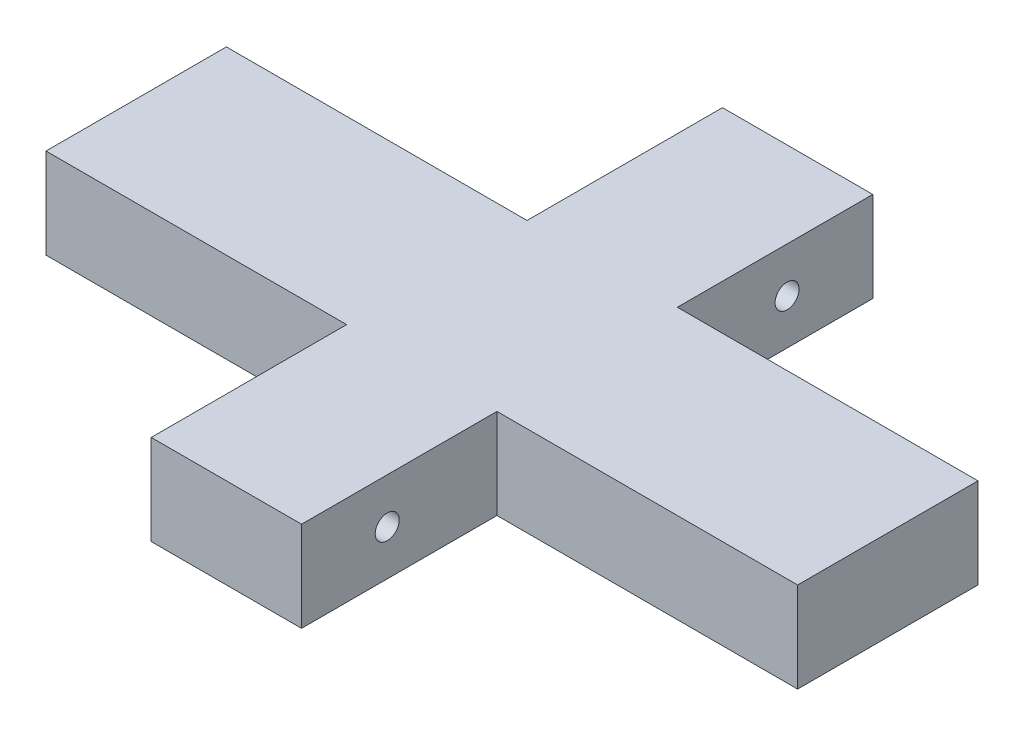
ISO-10303-21;
HEADER;
FILE_DESCRIPTION(('STEP AP214'),'2;1');
FILE_NAME('part.step','',(''),(''),'','','');
FILE_SCHEMA(('AUTOMOTIVE_DESIGN { 1 0 10303 214 1 1 1 1 }'));
ENDSEC;
DATA;
#1=APPLICATION_CONTEXT('core data for automotive mechanical design processes');
#2=APPLICATION_PROTOCOL_DEFINITION('international standard','automotive_design',2000,#1);
#3=PRODUCT_CONTEXT('',#1,'mechanical');
#4=PRODUCT('Part','Part','',(#3));
#5=PRODUCT_RELATED_PRODUCT_CATEGORY('part','',(#4));
#6=PRODUCT_DEFINITION_FORMATION('','',#4);
#7=PRODUCT_DEFINITION_CONTEXT('part definition',#1,'design');
#8=PRODUCT_DEFINITION('design','',#6,#7);
#9=PRODUCT_DEFINITION_SHAPE('','',#8);
#10=(LENGTH_UNIT() NAMED_UNIT(*) SI_UNIT(.MILLI.,.METRE.));
#11=(NAMED_UNIT(*) PLANE_ANGLE_UNIT() SI_UNIT($,.RADIAN.));
#12=(NAMED_UNIT(*) SI_UNIT($,.STERADIAN.) SOLID_ANGLE_UNIT());
#13=UNCERTAINTY_MEASURE_WITH_UNIT(LENGTH_MEASURE(1.E-05),#10,'distance_accuracy_value','');
#14=(GEOMETRIC_REPRESENTATION_CONTEXT(3) GLOBAL_UNCERTAINTY_ASSIGNED_CONTEXT((#13)) GLOBAL_UNIT_ASSIGNED_CONTEXT((#10,
#11,#12)) REPRESENTATION_CONTEXT('',''));
#15=CARTESIAN_POINT('',(0.,0.,0.));
#16=DIRECTION('',(0.,0.,1.));
#17=DIRECTION('',(1.,0.,0.));
#18=AXIS2_PLACEMENT_3D('',#15,#16,#17);
#19=CARTESIAN_POINT('',(-250.,60.,-60.));
#20=DIRECTION('',(1.,0.,0.));
#21=DIRECTION('',(0.,0.,-1.));
#22=AXIS2_PLACEMENT_3D('',#19,#20,#21);
#23=PLANE('',#22);
#24=DIRECTION('',(0.,0.,1.));
#25=VECTOR('',#24,1.);
#26=CARTESIAN_POINT('',(-250.,0.,-60.));
#27=LINE('',#26,#25);
#28=CARTESIAN_POINT('',(-250.,0.,-60.));
#29=VERTEX_POINT('',#28);
#30=CARTESIAN_POINT('',(-250.,0.,60.));
#31=VERTEX_POINT('',#30);
#32=EDGE_CURVE('E155',#29,#31,#27,.T.);
#33=ORIENTED_EDGE('',*,*,#32,.T.);
#34=DIRECTION('',(0.,-1.,0.));
#35=VECTOR('',#34,1.);
#36=CARTESIAN_POINT('',(-250.,60.,60.));
#37=LINE('',#36,#35);
#38=CARTESIAN_POINT('',(-250.,60.,60.));
#39=VERTEX_POINT('',#38);
#40=EDGE_CURVE('E11',#39,#31,#37,.T.);
#41=ORIENTED_EDGE('',*,*,#40,.F.);
#42=DIRECTION('',(0.,0.,1.));
#43=VECTOR('',#42,1.);
#44=CARTESIAN_POINT('',(-250.,60.,-60.));
#45=LINE('',#44,#43);
#46=CARTESIAN_POINT('',(-250.,60.,-60.));
#47=VERTEX_POINT('',#46);
#48=EDGE_CURVE('E178',#47,#39,#45,.T.);
#49=ORIENTED_EDGE('',*,*,#48,.F.);
#50=DIRECTION('',(0.,-1.,0.));
#51=VECTOR('',#50,1.);
#52=CARTESIAN_POINT('',(-250.,60.,-60.));
#53=LINE('',#52,#51);
#54=EDGE_CURVE('E151',#47,#29,#53,.T.);
#55=ORIENTED_EDGE('',*,*,#54,.T.);
#56=EDGE_LOOP('',(#33,#41,#49,#55));
#57=FACE_BOUND('',#56,.T.);
#58=ADVANCED_FACE('F33',(#57),#23,.F.);
#59=CARTESIAN_POINT('',(-50.,60.,59.9999999999999));
#60=DIRECTION('',(0.,0.,-1.));
#61=DIRECTION('',(-1.,0.,0.));
#62=AXIS2_PLACEMENT_3D('',#59,#60,#61);
#63=PLANE('',#62);
#64=DIRECTION('',(1.,0.,0.));
#65=VECTOR('',#64,1.);
#66=CARTESIAN_POINT('',(-50.,0.,59.9999999999999));
#67=LINE('',#66,#65);
#68=CARTESIAN_POINT('',(-50.,0.,59.9999999999999));
#69=VERTEX_POINT('',#68);
#70=EDGE_CURVE('E158',#31,#69,#67,.T.);
#71=ORIENTED_EDGE('',*,*,#70,.T.);
#72=DIRECTION('',(0.,-1.,0.));
#73=VECTOR('',#72,1.);
#74=CARTESIAN_POINT('',(-50.,60.,59.9999999999999));
#75=LINE('',#74,#73);
#76=CARTESIAN_POINT('',(-50.,60.,59.9999999999999));
#77=VERTEX_POINT('',#76);
#78=EDGE_CURVE('E42',#77,#69,#75,.T.);
#79=ORIENTED_EDGE('',*,*,#78,.F.);
#80=DIRECTION('',(1.,0.,0.));
#81=VECTOR('',#80,1.);
#82=CARTESIAN_POINT('',(-50.,60.,59.9999999999999));
#83=LINE('',#82,#81);
#84=EDGE_CURVE('E106',#39,#77,#83,.T.);
#85=ORIENTED_EDGE('',*,*,#84,.F.);
#86=ORIENTED_EDGE('',*,*,#40,.T.);
#87=EDGE_LOOP('',(#71,#79,#85,#86));
#88=FACE_BOUND('',#87,.T.);
#89=ADVANCED_FACE('F255',(#88),#63,.F.);
#90=CARTESIAN_POINT('',(-49.9999999999999,60.,190.));
#91=DIRECTION('',(1.,0.,0.));
#92=DIRECTION('',(0.,0.,-1.));
#93=AXIS2_PLACEMENT_3D('',#90,#91,#92);
#94=PLANE('',#93);
#95=CARTESIAN_POINT('',(-49.9999999999999,30.,133.));
#96=DIRECTION('',(1.,0.,0.));
#97=DIRECTION('',(0.,0.,-1.));
#98=AXIS2_PLACEMENT_3D('',#95,#96,#97);
#99=CIRCLE('',#98,8.00000000000004);
#100=CARTESIAN_POINT('',(-49.9999999999999,30.,125.));
#101=VERTEX_POINT('',#100);
#102=EDGE_CURVE('E159',#101,#101,#99,.T.);
#103=ORIENTED_EDGE('',*,*,#102,.T.);
#104=EDGE_LOOP('',(#103));
#105=FACE_BOUND('',#104,.T.);
#106=DIRECTION('',(0.,0.,1.));
#107=VECTOR('',#106,1.);
#108=CARTESIAN_POINT('',(-49.9999999999999,0.,190.));
#109=LINE('',#108,#107);
#110=CARTESIAN_POINT('',(-49.9999999999999,0.,190.));
#111=VERTEX_POINT('',#110);
#112=EDGE_CURVE('E161',#69,#111,#109,.T.);
#113=ORIENTED_EDGE('',*,*,#112,.T.);
#114=DIRECTION('',(0.,-1.,0.));
#115=VECTOR('',#114,1.);
#116=CARTESIAN_POINT('',(-49.9999999999999,60.,190.));
#117=LINE('',#116,#115);
#118=CARTESIAN_POINT('',(-49.9999999999999,60.,190.));
#119=VERTEX_POINT('',#118);
#120=EDGE_CURVE('E197',#119,#111,#117,.T.);
#121=ORIENTED_EDGE('',*,*,#120,.F.);
#122=DIRECTION('',(0.,0.,1.));
#123=VECTOR('',#122,1.);
#124=CARTESIAN_POINT('',(-49.9999999999999,60.,190.));
#125=LINE('',#124,#123);
#126=EDGE_CURVE('E216',#77,#119,#125,.T.);
#127=ORIENTED_EDGE('',*,*,#126,.F.);
#128=ORIENTED_EDGE('',*,*,#78,.T.);
#129=EDGE_LOOP('',(#113,#121,#127,#128));
#130=FACE_BOUND('',#129,.T.);
#131=ADVANCED_FACE('F259',(#105,#130),#94,.F.);
#132=CARTESIAN_POINT('',(50.0000000000001,60.,190.));
#133=DIRECTION('',(0.,0.,-1.));
#134=DIRECTION('',(-1.,0.,0.));
#135=AXIS2_PLACEMENT_3D('',#132,#133,#134);
#136=PLANE('',#135);
#137=DIRECTION('',(1.,0.,0.));
#138=VECTOR('',#137,1.);
#139=CARTESIAN_POINT('',(50.0000000000001,0.,190.));
#140=LINE('',#139,#138);
#141=CARTESIAN_POINT('',(50.0000000000001,0.,190.));
#142=VERTEX_POINT('',#141);
#143=EDGE_CURVE('E163',#111,#142,#140,.T.);
#144=ORIENTED_EDGE('',*,*,#143,.T.);
#145=DIRECTION('',(0.,-1.,0.));
#146=VECTOR('',#145,1.);
#147=CARTESIAN_POINT('',(50.0000000000001,60.,190.));
#148=LINE('',#147,#146);
#149=CARTESIAN_POINT('',(50.0000000000001,60.,190.));
#150=VERTEX_POINT('',#149);
#151=EDGE_CURVE('E194',#150,#142,#148,.T.);
#152=ORIENTED_EDGE('',*,*,#151,.F.);
#153=DIRECTION('',(1.,0.,0.));
#154=VECTOR('',#153,1.);
#155=CARTESIAN_POINT('',(50.0000000000001,60.,190.));
#156=LINE('',#155,#154);
#157=EDGE_CURVE('E218',#119,#150,#156,.T.);
#158=ORIENTED_EDGE('',*,*,#157,.F.);
#159=ORIENTED_EDGE('',*,*,#120,.T.);
#160=EDGE_LOOP('',(#144,#152,#158,#159));
#161=FACE_BOUND('',#160,.T.);
#162=ADVANCED_FACE('F263',(#161),#136,.F.);
#163=CARTESIAN_POINT('',(50.,60.,60.));
#164=DIRECTION('',(-1.,0.,0.));
#165=DIRECTION('',(0.,0.,1.));
#166=AXIS2_PLACEMENT_3D('',#163,#164,#165);
#167=PLANE('',#166);
#168=CARTESIAN_POINT('',(50.0000000000001,30.,133.));
#169=DIRECTION('',(-1.,0.,0.));
#170=DIRECTION('',(0.,0.,1.));
#171=AXIS2_PLACEMENT_3D('',#168,#169,#170);
#172=CIRCLE('',#171,8.00000000000004);
#173=CARTESIAN_POINT('',(50.0000000000001,30.,141.));
#174=VERTEX_POINT('',#173);
#175=EDGE_CURVE('E36',#174,#174,#172,.T.);
#176=ORIENTED_EDGE('',*,*,#175,.T.);
#177=EDGE_LOOP('',(#176));
#178=FACE_BOUND('',#177,.T.);
#179=DIRECTION('',(0.,0.,-1.));
#180=VECTOR('',#179,1.);
#181=CARTESIAN_POINT('',(50.,0.,60.));
#182=LINE('',#181,#180);
#183=CARTESIAN_POINT('',(50.,0.,60.));
#184=VERTEX_POINT('',#183);
#185=EDGE_CURVE('E165',#142,#184,#182,.T.);
#186=ORIENTED_EDGE('',*,*,#185,.T.);
#187=DIRECTION('',(0.,-1.,0.));
#188=VECTOR('',#187,1.);
#189=CARTESIAN_POINT('',(50.,60.,60.));
#190=LINE('',#189,#188);
#191=CARTESIAN_POINT('',(50.,60.,60.));
#192=VERTEX_POINT('',#191);
#193=EDGE_CURVE('E191',#192,#184,#190,.T.);
#194=ORIENTED_EDGE('',*,*,#193,.F.);
#195=DIRECTION('',(0.,0.,-1.));
#196=VECTOR('',#195,1.);
#197=CARTESIAN_POINT('',(50.,60.,60.));
#198=LINE('',#197,#196);
#199=EDGE_CURVE('E220',#150,#192,#198,.T.);
#200=ORIENTED_EDGE('',*,*,#199,.F.);
#201=ORIENTED_EDGE('',*,*,#151,.T.);
#202=EDGE_LOOP('',(#186,#194,#200,#201));
#203=FACE_BOUND('',#202,.T.);
#204=ADVANCED_FACE('F269',(#178,#203),#167,.F.);
#205=CARTESIAN_POINT('',(250.,60.,59.9999999999999));
#206=DIRECTION('',(0.,0.,-1.));
#207=DIRECTION('',(-1.,0.,0.));
#208=AXIS2_PLACEMENT_3D('',#205,#206,#207);
#209=PLANE('',#208);
#210=DIRECTION('',(1.,0.,0.));
#211=VECTOR('',#210,1.);
#212=CARTESIAN_POINT('',(250.,0.,59.9999999999999));
#213=LINE('',#212,#211);
#214=CARTESIAN_POINT('',(250.,0.,59.9999999999999));
#215=VERTEX_POINT('',#214);
#216=EDGE_CURVE('E167',#184,#215,#213,.T.);
#217=ORIENTED_EDGE('',*,*,#216,.T.);
#218=DIRECTION('',(0.,-1.,0.));
#219=VECTOR('',#218,1.);
#220=CARTESIAN_POINT('',(250.,60.,59.9999999999999));
#221=LINE('',#220,#219);
#222=CARTESIAN_POINT('',(250.,60.,59.9999999999999));
#223=VERTEX_POINT('',#222);
#224=EDGE_CURVE('E188',#223,#215,#221,.T.);
#225=ORIENTED_EDGE('',*,*,#224,.F.);
#226=DIRECTION('',(1.,0.,0.));
#227=VECTOR('',#226,1.);
#228=CARTESIAN_POINT('',(250.,60.,59.9999999999999));
#229=LINE('',#228,#227);
#230=EDGE_CURVE('E222',#192,#223,#229,.T.);
#231=ORIENTED_EDGE('',*,*,#230,.F.);
#232=ORIENTED_EDGE('',*,*,#193,.T.);
#233=EDGE_LOOP('',(#217,#225,#231,#232));
#234=FACE_BOUND('',#233,.T.);
#235=ADVANCED_FACE('F273',(#234),#209,.F.);
#236=CARTESIAN_POINT('',(250.,60.,-60.));
#237=DIRECTION('',(-1.,0.,0.));
#238=DIRECTION('',(0.,0.,1.));
#239=AXIS2_PLACEMENT_3D('',#236,#237,#238);
#240=PLANE('',#239);
#241=DIRECTION('',(0.,0.,-1.));
#242=VECTOR('',#241,1.);
#243=CARTESIAN_POINT('',(250.,0.,-60.));
#244=LINE('',#243,#242);
#245=CARTESIAN_POINT('',(250.,0.,-60.));
#246=VERTEX_POINT('',#245);
#247=EDGE_CURVE('E169',#215,#246,#244,.T.);
#248=ORIENTED_EDGE('',*,*,#247,.T.);
#249=DIRECTION('',(0.,-1.,0.));
#250=VECTOR('',#249,1.);
#251=CARTESIAN_POINT('',(250.,60.,-60.));
#252=LINE('',#251,#250);
#253=CARTESIAN_POINT('',(250.,60.,-60.));
#254=VERTEX_POINT('',#253);
#255=EDGE_CURVE('E185',#254,#246,#252,.T.);
#256=ORIENTED_EDGE('',*,*,#255,.F.);
#257=DIRECTION('',(0.,0.,-1.));
#258=VECTOR('',#257,1.);
#259=CARTESIAN_POINT('',(250.,60.,-60.));
#260=LINE('',#259,#258);
#261=EDGE_CURVE('E224',#223,#254,#260,.T.);
#262=ORIENTED_EDGE('',*,*,#261,.F.);
#263=ORIENTED_EDGE('',*,*,#224,.T.);
#264=EDGE_LOOP('',(#248,#256,#262,#263));
#265=FACE_BOUND('',#264,.T.);
#266=ADVANCED_FACE('F277',(#265),#240,.F.);
#267=CARTESIAN_POINT('',(50.,60.,-60.));
#268=DIRECTION('',(0.,0.,1.));
#269=DIRECTION('',(1.,0.,0.));
#270=AXIS2_PLACEMENT_3D('',#267,#268,#269);
#271=PLANE('',#270);
#272=DIRECTION('',(-1.,0.,0.));
#273=VECTOR('',#272,1.);
#274=CARTESIAN_POINT('',(50.,0.,-60.));
#275=LINE('',#274,#273);
#276=CARTESIAN_POINT('',(50.,0.,-60.));
#277=VERTEX_POINT('',#276);
#278=EDGE_CURVE('E171',#246,#277,#275,.T.);
#279=ORIENTED_EDGE('',*,*,#278,.T.);
#280=DIRECTION('',(0.,-1.,0.));
#281=VECTOR('',#280,1.);
#282=CARTESIAN_POINT('',(50.,60.,-60.));
#283=LINE('',#282,#281);
#284=CARTESIAN_POINT('',(50.,60.,-60.));
#285=VERTEX_POINT('',#284);
#286=EDGE_CURVE('E182',#285,#277,#283,.T.);
#287=ORIENTED_EDGE('',*,*,#286,.F.);
#288=DIRECTION('',(-1.,0.,0.));
#289=VECTOR('',#288,1.);
#290=CARTESIAN_POINT('',(50.,60.,-60.));
#291=LINE('',#290,#289);
#292=EDGE_CURVE('E226',#254,#285,#291,.T.);
#293=ORIENTED_EDGE('',*,*,#292,.F.);
#294=ORIENTED_EDGE('',*,*,#255,.T.);
#295=EDGE_LOOP('',(#279,#287,#293,#294));
#296=FACE_BOUND('',#295,.T.);
#297=ADVANCED_FACE('F232',(#296),#271,.F.);
#298=CARTESIAN_POINT('',(50.0000000000001,60.,-190.));
#299=DIRECTION('',(-1.,0.,0.));
#300=DIRECTION('',(0.,0.,1.));
#301=AXIS2_PLACEMENT_3D('',#298,#299,#300);
#302=PLANE('',#301);
#303=CARTESIAN_POINT('',(50.0000000000001,30.,-133.));
#304=DIRECTION('',(-1.,0.,0.));
#305=DIRECTION('',(0.,0.,1.));
#306=AXIS2_PLACEMENT_3D('',#303,#304,#305);
#307=CIRCLE('',#306,8.00000000000001);
#308=CARTESIAN_POINT('',(50.0000000000001,30.,-125.));
#309=VERTEX_POINT('',#308);
#310=EDGE_CURVE('E203',#309,#309,#307,.T.);
#311=ORIENTED_EDGE('',*,*,#310,.T.);
#312=EDGE_LOOP('',(#311));
#313=FACE_BOUND('',#312,.T.);
#314=DIRECTION('',(0.,0.,-1.));
#315=VECTOR('',#314,1.);
#316=CARTESIAN_POINT('',(50.0000000000001,0.,-190.));
#317=LINE('',#316,#315);
#318=CARTESIAN_POINT('',(50.0000000000001,0.,-190.));
#319=VERTEX_POINT('',#318);
#320=EDGE_CURVE('E173',#277,#319,#317,.T.);
#321=ORIENTED_EDGE('',*,*,#320,.T.);
#322=DIRECTION('',(0.,-1.,0.));
#323=VECTOR('',#322,1.);
#324=CARTESIAN_POINT('',(50.0000000000001,60.,-190.));
#325=LINE('',#324,#323);
#326=CARTESIAN_POINT('',(50.0000000000001,60.,-190.));
#327=VERTEX_POINT('',#326);
#328=EDGE_CURVE('E146',#327,#319,#325,.T.);
#329=ORIENTED_EDGE('',*,*,#328,.F.);
#330=DIRECTION('',(0.,0.,-1.));
#331=VECTOR('',#330,1.);
#332=CARTESIAN_POINT('',(50.0000000000001,60.,-190.));
#333=LINE('',#332,#331);
#334=EDGE_CURVE('E137',#285,#327,#333,.T.);
#335=ORIENTED_EDGE('',*,*,#334,.F.);
#336=ORIENTED_EDGE('',*,*,#286,.T.);
#337=EDGE_LOOP('',(#321,#329,#335,#336));
#338=FACE_BOUND('',#337,.T.);
#339=ADVANCED_FACE('F236',(#313,#338),#302,.F.);
#340=CARTESIAN_POINT('',(-49.9999999999999,60.,-190.));
#341=DIRECTION('',(0.,0.,1.));
#342=DIRECTION('',(1.,0.,0.));
#343=AXIS2_PLACEMENT_3D('',#340,#341,#342);
#344=PLANE('',#343);
#345=DIRECTION('',(-1.,0.,0.));
#346=VECTOR('',#345,1.);
#347=CARTESIAN_POINT('',(-49.9999999999999,0.,-190.));
#348=LINE('',#347,#346);
#349=CARTESIAN_POINT('',(-49.9999999999999,0.,-190.));
#350=VERTEX_POINT('',#349);
#351=EDGE_CURVE('E145',#319,#350,#348,.T.);
#352=ORIENTED_EDGE('',*,*,#351,.T.);
#353=DIRECTION('',(0.,-1.,0.));
#354=VECTOR('',#353,1.);
#355=CARTESIAN_POINT('',(-49.9999999999999,60.,-190.));
#356=LINE('',#355,#354);
#357=CARTESIAN_POINT('',(-49.9999999999999,60.,-190.));
#358=VERTEX_POINT('',#357);
#359=EDGE_CURVE('E142',#358,#350,#356,.T.);
#360=ORIENTED_EDGE('',*,*,#359,.F.);
#361=DIRECTION('',(-1.,0.,0.));
#362=VECTOR('',#361,1.);
#363=CARTESIAN_POINT('',(-49.9999999999999,60.,-190.));
#364=LINE('',#363,#362);
#365=EDGE_CURVE('E131',#327,#358,#364,.T.);
#366=ORIENTED_EDGE('',*,*,#365,.F.);
#367=ORIENTED_EDGE('',*,*,#328,.T.);
#368=EDGE_LOOP('',(#352,#360,#366,#367));
#369=FACE_BOUND('',#368,.T.);
#370=ADVANCED_FACE('F143',(#369),#344,.F.);
#371=CARTESIAN_POINT('',(-50.,60.,-60.));
#372=DIRECTION('',(1.,0.,0.));
#373=DIRECTION('',(0.,0.,-1.));
#374=AXIS2_PLACEMENT_3D('',#371,#372,#373);
#375=PLANE('',#374);
#376=CARTESIAN_POINT('',(-50.,30.,-133.));
#377=DIRECTION('',(1.,0.,0.));
#378=DIRECTION('',(0.,0.,-1.));
#379=AXIS2_PLACEMENT_3D('',#376,#377,#378);
#380=CIRCLE('',#379,8.00000000000001);
#381=CARTESIAN_POINT('',(-50.,30.,-141.));
#382=VERTEX_POINT('',#381);
#383=EDGE_CURVE('E201',#382,#382,#380,.T.);
#384=ORIENTED_EDGE('',*,*,#383,.T.);
#385=EDGE_LOOP('',(#384));
#386=FACE_BOUND('',#385,.T.);
#387=DIRECTION('',(0.,0.,1.));
#388=VECTOR('',#387,1.);
#389=CARTESIAN_POINT('',(-50.,0.,-60.));
#390=LINE('',#389,#388);
#391=CARTESIAN_POINT('',(-50.,0.,-60.));
#392=VERTEX_POINT('',#391);
#393=EDGE_CURVE('E92',#350,#392,#390,.T.);
#394=ORIENTED_EDGE('',*,*,#393,.T.);
#395=DIRECTION('',(0.,-1.,0.));
#396=VECTOR('',#395,1.);
#397=CARTESIAN_POINT('',(-50.,60.,-60.));
#398=LINE('',#397,#396);
#399=CARTESIAN_POINT('',(-50.,60.,-60.));
#400=VERTEX_POINT('',#399);
#401=EDGE_CURVE('E147',#400,#392,#398,.T.);
#402=ORIENTED_EDGE('',*,*,#401,.F.);
#403=DIRECTION('',(0.,0.,1.));
#404=VECTOR('',#403,1.);
#405=CARTESIAN_POINT('',(-50.,60.,-60.));
#406=LINE('',#405,#404);
#407=EDGE_CURVE('E135',#358,#400,#406,.T.);
#408=ORIENTED_EDGE('',*,*,#407,.F.);
#409=ORIENTED_EDGE('',*,*,#359,.T.);
#410=EDGE_LOOP('',(#394,#402,#408,#409));
#411=FACE_BOUND('',#410,.T.);
#412=ADVANCED_FACE('F149',(#386,#411),#375,.F.);
#413=CARTESIAN_POINT('',(-250.,60.,-60.));
#414=DIRECTION('',(0.,0.,1.));
#415=DIRECTION('',(1.,0.,0.));
#416=AXIS2_PLACEMENT_3D('',#413,#414,#415);
#417=PLANE('',#416);
#418=DIRECTION('',(-1.,0.,0.));
#419=VECTOR('',#418,1.);
#420=CARTESIAN_POINT('',(-250.,0.,-60.));
#421=LINE('',#420,#419);
#422=EDGE_CURVE('E98',#392,#29,#421,.T.);
#423=ORIENTED_EDGE('',*,*,#422,.T.);
#424=ORIENTED_EDGE('',*,*,#54,.F.);
#425=DIRECTION('',(-1.,0.,0.));
#426=VECTOR('',#425,1.);
#427=CARTESIAN_POINT('',(-250.,60.,-60.));
#428=LINE('',#427,#426);
#429=EDGE_CURVE('E51',#400,#47,#428,.T.);
#430=ORIENTED_EDGE('',*,*,#429,.F.);
#431=ORIENTED_EDGE('',*,*,#401,.T.);
#432=EDGE_LOOP('',(#423,#424,#430,#431));
#433=FACE_BOUND('',#432,.T.);
#434=ADVANCED_FACE('F244',(#433),#417,.F.);
#435=CARTESIAN_POINT('',(0.,60.,0.));
#436=DIRECTION('',(0.,-1.,0.));
#437=DIRECTION('',(0.,0.,-1.));
#438=AXIS2_PLACEMENT_3D('',#435,#436,#437);
#439=PLANE('',#438);
#440=ORIENTED_EDGE('',*,*,#48,.T.);
#441=ORIENTED_EDGE('',*,*,#84,.T.);
#442=ORIENTED_EDGE('',*,*,#126,.T.);
#443=ORIENTED_EDGE('',*,*,#157,.T.);
#444=ORIENTED_EDGE('',*,*,#199,.T.);
#445=ORIENTED_EDGE('',*,*,#230,.T.);
#446=ORIENTED_EDGE('',*,*,#261,.T.);
#447=ORIENTED_EDGE('',*,*,#292,.T.);
#448=ORIENTED_EDGE('',*,*,#334,.T.);
#449=ORIENTED_EDGE('',*,*,#365,.T.);
#450=ORIENTED_EDGE('',*,*,#407,.T.);
#451=ORIENTED_EDGE('',*,*,#429,.T.);
#452=EDGE_LOOP('',(#440,#441,#442,#443,#444,#445,#446,#447,#448,#449,#450,#451));
#453=FACE_BOUND('',#452,.T.);
#454=ADVANCED_FACE('F133',(#453),#439,.F.);
#455=CARTESIAN_POINT('',(0.,0.,0.));
#456=DIRECTION('',(0.,-1.,0.));
#457=DIRECTION('',(0.,0.,-1.));
#458=AXIS2_PLACEMENT_3D('',#455,#456,#457);
#459=PLANE('',#458);
#460=ORIENTED_EDGE('',*,*,#32,.F.);
#461=ORIENTED_EDGE('',*,*,#422,.F.);
#462=ORIENTED_EDGE('',*,*,#393,.F.);
#463=ORIENTED_EDGE('',*,*,#351,.F.);
#464=ORIENTED_EDGE('',*,*,#320,.F.);
#465=ORIENTED_EDGE('',*,*,#278,.F.);
#466=ORIENTED_EDGE('',*,*,#247,.F.);
#467=ORIENTED_EDGE('',*,*,#216,.F.);
#468=ORIENTED_EDGE('',*,*,#185,.F.);
#469=ORIENTED_EDGE('',*,*,#143,.F.);
#470=ORIENTED_EDGE('',*,*,#112,.F.);
#471=ORIENTED_EDGE('',*,*,#70,.F.);
#472=EDGE_LOOP('',(#460,#461,#462,#463,#464,#465,#466,#467,#468,#469,#470,#471));
#473=FACE_BOUND('',#472,.T.);
#474=ADVANCED_FACE('F239',(#473),#459,.T.);
#475=CARTESIAN_POINT('',(250.,30.,-133.));
#476=DIRECTION('',(-1.,0.,0.));
#477=DIRECTION('',(0.,0.,1.));
#478=AXIS2_PLACEMENT_3D('',#475,#476,#477);
#479=CYLINDRICAL_SURFACE('',#478,8.00000000000001);
#480=ORIENTED_EDGE('',*,*,#383,.F.);
#481=EDGE_LOOP('',(#480));
#482=FACE_BOUND('',#481,.T.);
#483=ORIENTED_EDGE('',*,*,#310,.F.);
#484=EDGE_LOOP('',(#483));
#485=FACE_BOUND('',#484,.T.);
#486=ADVANCED_FACE('F305',(#482,#485),#479,.F.);
#487=CARTESIAN_POINT('',(250.,30.,133.));
#488=DIRECTION('',(-1.,0.,0.));
#489=DIRECTION('',(0.,0.,1.));
#490=AXIS2_PLACEMENT_3D('',#487,#488,#489);
#491=CYLINDRICAL_SURFACE('',#490,8.00000000000004);
#492=ORIENTED_EDGE('',*,*,#175,.F.);
#493=EDGE_LOOP('',(#492));
#494=FACE_BOUND('',#493,.T.);
#495=ORIENTED_EDGE('',*,*,#102,.F.);
#496=EDGE_LOOP('',(#495));
#497=FACE_BOUND('',#496,.T.);
#498=ADVANCED_FACE('F310',(#494,#497),#491,.F.);
#499=CLOSED_SHELL('',(#58,#89,#131,#162,#204,#235,#266,#297,#339,#370,#412,#434,#454,#474,#486,#498));
#500=MANIFOLD_SOLID_BREP('B2',#499);
#501=ADVANCED_BREP_SHAPE_REPRESENTATION('',(#18,#500),#14);
#502=SHAPE_DEFINITION_REPRESENTATION(#9,#501);
ENDSEC;
END-ISO-10303-21;
